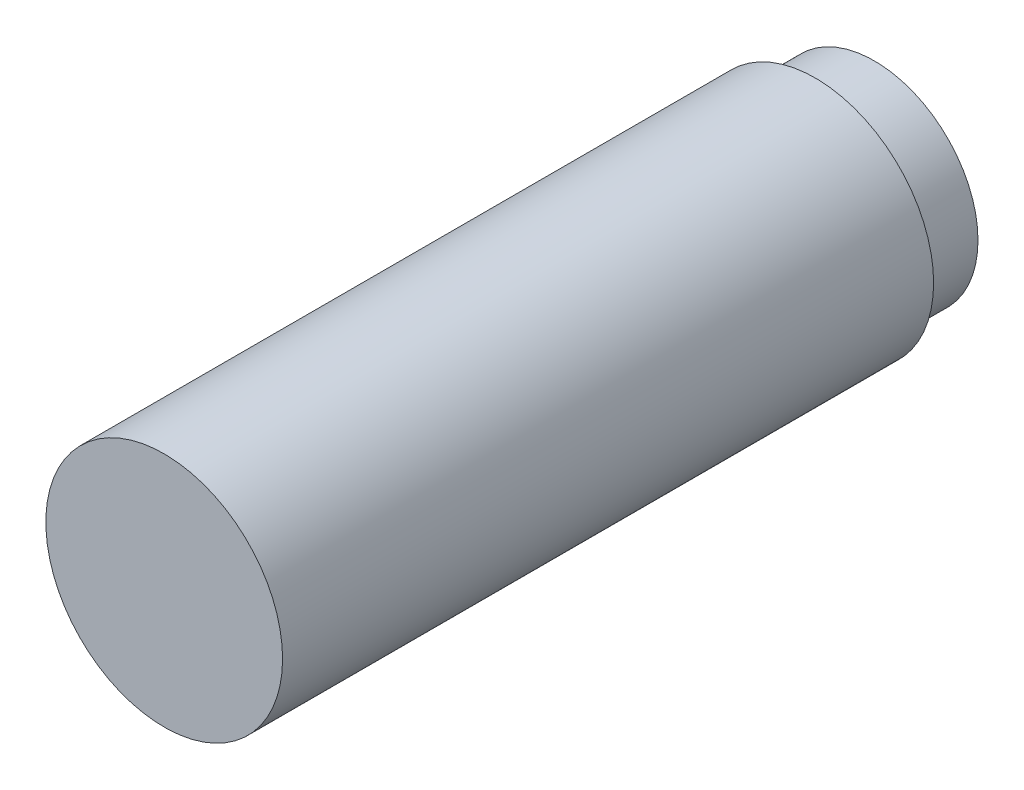
ISO-10303-21;
HEADER;
FILE_DESCRIPTION(('STEP AP214'),'2;1');
FILE_NAME('part.step','',(''),(''),'','','');
FILE_SCHEMA(('AUTOMOTIVE_DESIGN { 1 0 10303 214 1 1 1 1 }'));
ENDSEC;
DATA;
#1=APPLICATION_CONTEXT('core data for automotive mechanical design processes');
#2=APPLICATION_PROTOCOL_DEFINITION('international standard','automotive_design',2000,#1);
#3=PRODUCT_CONTEXT('',#1,'mechanical');
#4=PRODUCT('Part','Part','',(#3));
#5=PRODUCT_RELATED_PRODUCT_CATEGORY('part','',(#4));
#6=PRODUCT_DEFINITION_FORMATION('','',#4);
#7=PRODUCT_DEFINITION_CONTEXT('part definition',#1,'design');
#8=PRODUCT_DEFINITION('design','',#6,#7);
#9=PRODUCT_DEFINITION_SHAPE('','',#8);
#10=(LENGTH_UNIT() NAMED_UNIT(*) SI_UNIT(.MILLI.,.METRE.));
#11=(NAMED_UNIT(*) PLANE_ANGLE_UNIT() SI_UNIT($,.RADIAN.));
#12=(NAMED_UNIT(*) SI_UNIT($,.STERADIAN.) SOLID_ANGLE_UNIT());
#13=UNCERTAINTY_MEASURE_WITH_UNIT(LENGTH_MEASURE(1.E-05),#10,'distance_accuracy_value','');
#14=(GEOMETRIC_REPRESENTATION_CONTEXT(3) GLOBAL_UNCERTAINTY_ASSIGNED_CONTEXT((#13)) GLOBAL_UNIT_ASSIGNED_CONTEXT((#10,
#11,#12)) REPRESENTATION_CONTEXT('',''));
#15=CARTESIAN_POINT('',(0.,0.,0.));
#16=DIRECTION('',(0.,0.,1.));
#17=DIRECTION('',(1.,0.,0.));
#18=AXIS2_PLACEMENT_3D('',#15,#16,#17);
#19=CARTESIAN_POINT('',(0.,0.,-76.2));
#20=DIRECTION('',(0.,0.,1.));
#21=DIRECTION('',(1.,0.,0.));
#22=AXIS2_PLACEMENT_3D('',#19,#20,#21);
#23=CYLINDRICAL_SURFACE('',#22,25.4);
#24=CARTESIAN_POINT('',(0.,0.,76.2));
#25=DIRECTION('',(0.,0.,1.));
#26=DIRECTION('',(1.,0.,0.));
#27=AXIS2_PLACEMENT_3D('',#24,#25,#26);
#28=CIRCLE('',#27,25.4);
#29=CARTESIAN_POINT('',(25.4,0.,76.2));
#30=VERTEX_POINT('',#29);
#31=EDGE_CURVE('E10',#30,#30,#28,.T.);
#32=CARTESIAN_POINT('',(0.,0.,-63.5));
#33=DIRECTION('',(0.,0.,-1.));
#34=DIRECTION('',(-1.,0.,0.));
#35=AXIS2_PLACEMENT_3D('',#32,#33,#34);
#36=CIRCLE('',#35,25.4);
#37=CARTESIAN_POINT('',(25.4,0.,-63.5));
#38=VERTEX_POINT('',#37);
#39=EDGE_CURVE('E43',#38,#38,#36,.T.);
#40=CARTESIAN_POINT('',(25.4,0.,76.2));
#41=CARTESIAN_POINT('',(25.4,0.,74.7447916666667));
#42=CARTESIAN_POINT('',(25.4,0.,73.2895833333333));
#43=CARTESIAN_POINT('',(25.4,0.,70.3791666666667));
#44=CARTESIAN_POINT('',(25.4,0.,68.9239583333333));
#45=CARTESIAN_POINT('',(25.4,0.,66.0135416666667));
#46=CARTESIAN_POINT('',(25.4,0.,64.5583333333333));
#47=CARTESIAN_POINT('',(25.4,0.,61.6479166666667));
#48=CARTESIAN_POINT('',(25.4,0.,60.1927083333333));
#49=CARTESIAN_POINT('',(25.4,0.,57.2822916666667));
#50=CARTESIAN_POINT('',(25.4,0.,55.8270833333333));
#51=CARTESIAN_POINT('',(25.4,0.,52.9166666666667));
#52=CARTESIAN_POINT('',(25.4,0.,51.4614583333333));
#53=CARTESIAN_POINT('',(25.4,0.,48.5510416666667));
#54=CARTESIAN_POINT('',(25.4,0.,47.0958333333333));
#55=CARTESIAN_POINT('',(25.4,0.,44.1854166666667));
#56=CARTESIAN_POINT('',(25.4,0.,42.7302083333333));
#57=CARTESIAN_POINT('',(25.4,0.,39.8197916666667));
#58=CARTESIAN_POINT('',(25.4,0.,38.3645833333333));
#59=CARTESIAN_POINT('',(25.4,0.,35.4541666666667));
#60=CARTESIAN_POINT('',(25.4,0.,33.9989583333333));
#61=CARTESIAN_POINT('',(25.4,0.,31.0885416666667));
#62=CARTESIAN_POINT('',(25.4,0.,29.6333333333333));
#63=CARTESIAN_POINT('',(25.4,0.,26.7229166666667));
#64=CARTESIAN_POINT('',(25.4,0.,25.2677083333333));
#65=CARTESIAN_POINT('',(25.4,0.,22.3572916666667));
#66=CARTESIAN_POINT('',(25.4,0.,20.9020833333333));
#67=CARTESIAN_POINT('',(25.4,0.,17.9916666666667));
#68=CARTESIAN_POINT('',(25.4,0.,16.5364583333333));
#69=CARTESIAN_POINT('',(25.4,0.,13.6260416666667));
#70=CARTESIAN_POINT('',(25.4,0.,12.1708333333333));
#71=CARTESIAN_POINT('',(25.4,0.,9.26041666666667));
#72=CARTESIAN_POINT('',(25.4,0.,7.80520833333334));
#73=CARTESIAN_POINT('',(25.4,0.,4.89479166666668));
#74=CARTESIAN_POINT('',(25.4,0.,3.43958333333334));
#75=CARTESIAN_POINT('',(25.4,0.,0.529166666666678));
#76=CARTESIAN_POINT('',(25.4,0.,-0.926041666666655));
#77=CARTESIAN_POINT('',(25.4,0.,-3.83645833333332));
#78=CARTESIAN_POINT('',(25.4,0.,-5.29166666666666));
#79=CARTESIAN_POINT('',(25.4,0.,-8.20208333333333));
#80=CARTESIAN_POINT('',(25.4,0.,-9.65729166666666));
#81=CARTESIAN_POINT('',(25.4,0.,-12.5677083333333));
#82=CARTESIAN_POINT('',(25.4,0.,-14.0229166666667));
#83=CARTESIAN_POINT('',(25.4,0.,-16.9333333333333));
#84=CARTESIAN_POINT('',(25.4,0.,-18.3885416666667));
#85=CARTESIAN_POINT('',(25.4,0.,-21.2989583333333));
#86=CARTESIAN_POINT('',(25.4,0.,-22.7541666666667));
#87=CARTESIAN_POINT('',(25.4,0.,-25.6645833333333));
#88=CARTESIAN_POINT('',(25.4,0.,-27.1197916666667));
#89=CARTESIAN_POINT('',(25.4,0.,-30.0302083333333));
#90=CARTESIAN_POINT('',(25.4,0.,-31.4854166666667));
#91=CARTESIAN_POINT('',(25.4,0.,-34.3958333333333));
#92=CARTESIAN_POINT('',(25.4,0.,-35.8510416666667));
#93=CARTESIAN_POINT('',(25.4,0.,-38.7614583333333));
#94=CARTESIAN_POINT('',(25.4,0.,-40.2166666666667));
#95=CARTESIAN_POINT('',(25.4,0.,-43.1270833333333));
#96=CARTESIAN_POINT('',(25.4,0.,-44.5822916666666));
#97=CARTESIAN_POINT('',(25.4,0.,-47.4927083333333));
#98=CARTESIAN_POINT('',(25.4,0.,-48.9479166666666));
#99=CARTESIAN_POINT('',(25.4,0.,-51.8583333333333));
#100=CARTESIAN_POINT('',(25.4,0.,-53.3135416666667));
#101=CARTESIAN_POINT('',(25.4,0.,-56.2239583333333));
#102=CARTESIAN_POINT('',(25.4,0.,-57.6791666666667));
#103=CARTESIAN_POINT('',(25.4,0.,-60.5895833333333));
#104=CARTESIAN_POINT('',(25.4,0.,-62.0447916666666));
#105=CARTESIAN_POINT('',(25.4,0.,-63.5));
#106=B_SPLINE_CURVE_WITH_KNOTS('',3,(#40,#41,#42,#43,#44,#45,#46,#47,#48,#49,#50,#51,#52,#53,
#54,#55,#56,#57,#58,#59,#60,#61,#62,#63,#64,#65,#66,#67,#68,#69,#70,#71,#72,#73,#74,#75,#76,#77,
#78,#79,#80,#81,#82,#83,#84,#85,#86,#87,#88,#89,#90,#91,#92,#93,#94,#95,#96,#97,#98,#99,#100,
#101,#102,#103,#104,#105),.UNSPECIFIED.,.F.,.F.,(4,2,2,2,2,2,2,2,2,2,2,2,2,2,2,2,2,2,2,2,2,2,2,
2,2,2,2,2,2,2,2,2,4),(0.,4.36562500000001,8.73125,13.096875,17.4625,21.828125,26.19375,
30.559375,34.925,39.290625,43.65625,48.021875,52.3875,56.753125,61.11875,65.484375,69.85,
74.215625,78.58125,82.946875,87.3125,91.678125,96.04375,100.409375,104.775,109.140625,113.50625,
117.871875,122.2375,126.603125,130.96875,135.334375,139.7),.UNSPECIFIED.);
#107=EDGE_CURVE('BSEAM36',#30,#38,#106,.T.);
#108=ORIENTED_EDGE('',*,*,#31,.F.);
#109=ORIENTED_EDGE('',*,*,#39,.F.);
#110=ORIENTED_EDGE('',*,*,#107,.T.);
#111=ORIENTED_EDGE('',*,*,#107,.F.);
#112=EDGE_LOOP('',(#108,#110,#109,#111));
#113=FACE_BOUND('',#112,.T.);
#114=ADVANCED_FACE('F36',(#113),#23,.T.);
#115=CARTESIAN_POINT('',(0.,0.,76.2));
#116=DIRECTION('',(0.,0.,1.));
#117=DIRECTION('',(1.,0.,0.));
#118=AXIS2_PLACEMENT_3D('',#115,#116,#117);
#119=PLANE('',#118);
#120=ORIENTED_EDGE('',*,*,#31,.T.);
#121=EDGE_LOOP('',(#120));
#122=FACE_BOUND('',#121,.T.);
#123=ADVANCED_FACE('F72',(#122),#119,.T.);
#124=CARTESIAN_POINT('',(0.,0.,-63.5));
#125=DIRECTION('',(0.,0.,-1.));
#126=DIRECTION('',(-1.,0.,0.));
#127=AXIS2_PLACEMENT_3D('',#124,#125,#126);
#128=PLANE('',#127);
#129=CARTESIAN_POINT('',(0.,0.,-63.5));
#130=DIRECTION('',(0.,0.,-1.));
#131=DIRECTION('',(-1.,0.,0.));
#132=AXIS2_PLACEMENT_3D('',#129,#130,#131);
#133=CIRCLE('',#132,22.225);
#134=CARTESIAN_POINT('',(-22.225,0.,-63.5));
#135=VERTEX_POINT('',#134);
#136=EDGE_CURVE('E48',#135,#135,#133,.T.);
#137=ORIENTED_EDGE('',*,*,#136,.F.);
#138=EDGE_LOOP('',(#137));
#139=FACE_BOUND('',#138,.T.);
#140=ORIENTED_EDGE('',*,*,#39,.T.);
#141=EDGE_LOOP('',(#140));
#142=FACE_BOUND('',#141,.T.);
#143=ADVANCED_FACE('F64',(#139,#142),#128,.T.);
#144=CARTESIAN_POINT('',(0.,0.,-63.5));
#145=DIRECTION('',(0.,0.,-1.));
#146=DIRECTION('',(-1.,0.,0.));
#147=AXIS2_PLACEMENT_3D('',#144,#145,#146);
#148=CYLINDRICAL_SURFACE('',#147,22.225);
#149=ORIENTED_EDGE('',*,*,#136,.T.);
#150=EDGE_LOOP('',(#149));
#151=FACE_BOUND('',#150,.T.);
#152=CARTESIAN_POINT('',(0.,0.,-76.2));
#153=DIRECTION('',(0.,0.,-1.));
#154=DIRECTION('',(-1.,0.,0.));
#155=AXIS2_PLACEMENT_3D('',#152,#153,#154);
#156=CIRCLE('',#155,22.225);
#157=CARTESIAN_POINT('',(-22.225,0.,-76.2));
#158=VERTEX_POINT('',#157);
#159=EDGE_CURVE('E53',#158,#158,#156,.T.);
#160=ORIENTED_EDGE('',*,*,#159,.F.);
#161=EDGE_LOOP('',(#160));
#162=FACE_BOUND('',#161,.T.);
#163=ADVANCED_FACE('F62',(#151,#162),#148,.T.);
#164=CARTESIAN_POINT('',(0.,0.,-76.2));
#165=DIRECTION('',(0.,0.,1.));
#166=DIRECTION('',(1.,0.,0.));
#167=AXIS2_PLACEMENT_3D('',#164,#165,#166);
#168=PLANE('',#167);
#169=ORIENTED_EDGE('',*,*,#159,.T.);
#170=EDGE_LOOP('',(#169));
#171=FACE_BOUND('',#170,.T.);
#172=ADVANCED_FACE('F60',(#171),#168,.F.);
#173=CLOSED_SHELL('',(#114,#123,#143,#163,#172));
#174=MANIFOLD_SOLID_BREP('B2',#173);
#175=ADVANCED_BREP_SHAPE_REPRESENTATION('',(#18,#174),#14);
#176=SHAPE_DEFINITION_REPRESENTATION(#9,#175);
ENDSEC;
END-ISO-10303-21;
